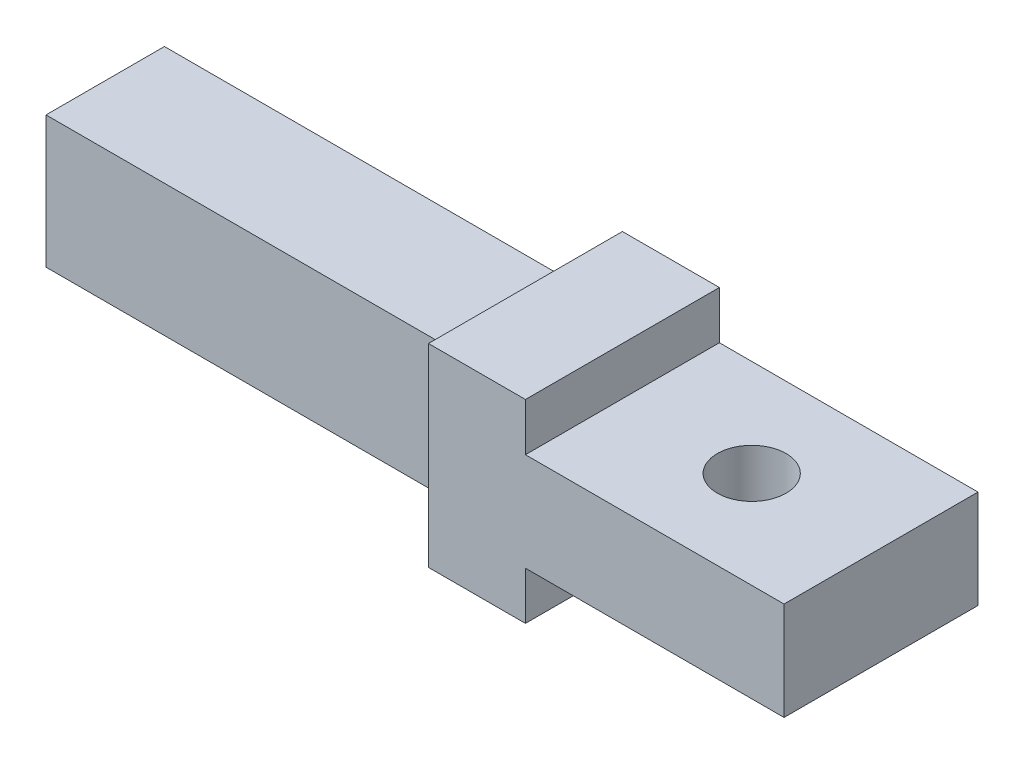
ISO-10303-21;
HEADER;
FILE_DESCRIPTION(('STEP AP214'),'2;1');
FILE_NAME('part.step','',(''),(''),'','','');
FILE_SCHEMA(('AUTOMOTIVE_DESIGN { 1 0 10303 214 1 1 1 1 }'));
ENDSEC;
DATA;
#1=APPLICATION_CONTEXT('core data for automotive mechanical design processes');
#2=APPLICATION_PROTOCOL_DEFINITION('international standard','automotive_design',2000,#1);
#3=PRODUCT_CONTEXT('',#1,'mechanical');
#4=PRODUCT('Part','Part','',(#3));
#5=PRODUCT_RELATED_PRODUCT_CATEGORY('part','',(#4));
#6=PRODUCT_DEFINITION_FORMATION('','',#4);
#7=PRODUCT_DEFINITION_CONTEXT('part definition',#1,'design');
#8=PRODUCT_DEFINITION('design','',#6,#7);
#9=PRODUCT_DEFINITION_SHAPE('','',#8);
#10=(LENGTH_UNIT() NAMED_UNIT(*) SI_UNIT(.MILLI.,.METRE.));
#11=(NAMED_UNIT(*) PLANE_ANGLE_UNIT() SI_UNIT($,.RADIAN.));
#12=(NAMED_UNIT(*) SI_UNIT($,.STERADIAN.) SOLID_ANGLE_UNIT());
#13=UNCERTAINTY_MEASURE_WITH_UNIT(LENGTH_MEASURE(1.E-05),#10,'distance_accuracy_value','');
#14=(GEOMETRIC_REPRESENTATION_CONTEXT(3) GLOBAL_UNCERTAINTY_ASSIGNED_CONTEXT((#13)) GLOBAL_UNIT_ASSIGNED_CONTEXT((#10,
#11,#12)) REPRESENTATION_CONTEXT('',''));
#15=CARTESIAN_POINT('',(0.,0.,0.));
#16=DIRECTION('',(0.,0.,1.));
#17=DIRECTION('',(1.,0.,0.));
#18=AXIS2_PLACEMENT_3D('',#15,#16,#17);
#19=CARTESIAN_POINT('',(76.2,0.,0.));
#20=DIRECTION('',(0.,0.,-1.));
#21=DIRECTION('',(-1.,0.,0.));
#22=AXIS2_PLACEMENT_3D('',#19,#20,#21);
#23=PLANE('',#22);
#24=DIRECTION('',(0.,1.,0.));
#25=VECTOR('',#24,1.);
#26=CARTESIAN_POINT('',(41.275,19.05,0.));
#27=LINE('',#26,#25);
#28=CARTESIAN_POINT('',(41.275,0.,0.));
#29=VERTEX_POINT('',#28);
#30=CARTESIAN_POINT('',(41.275,19.05,0.));
#31=VERTEX_POINT('',#30);
#32=EDGE_CURVE('E162',#29,#31,#27,.T.);
#33=ORIENTED_EDGE('',*,*,#32,.F.);
#34=DIRECTION('',(-1.,0.,0.));
#35=VECTOR('',#34,1.);
#36=CARTESIAN_POINT('',(76.2,0.,0.));
#37=LINE('',#36,#35);
#38=CARTESIAN_POINT('',(50.8,0.,0.));
#39=VERTEX_POINT('',#38);
#40=EDGE_CURVE('E11',#39,#29,#37,.T.);
#41=ORIENTED_EDGE('',*,*,#40,.F.);
#42=DIRECTION('',(0.,-1.,0.));
#43=VECTOR('',#42,1.);
#44=CARTESIAN_POINT('',(50.8,0.,0.));
#45=LINE('',#44,#43);
#46=CARTESIAN_POINT('',(50.8,4.699,0.));
#47=VERTEX_POINT('',#46);
#48=EDGE_CURVE('E195',#47,#39,#45,.T.);
#49=ORIENTED_EDGE('',*,*,#48,.F.);
#50=DIRECTION('',(-1.,0.,0.));
#51=VECTOR('',#50,1.);
#52=CARTESIAN_POINT('',(76.2,4.699,0.));
#53=LINE('',#52,#51);
#54=CARTESIAN_POINT('',(76.2,4.699,0.));
#55=VERTEX_POINT('',#54);
#56=EDGE_CURVE('E179',#55,#47,#53,.T.);
#57=ORIENTED_EDGE('',*,*,#56,.F.);
#58=DIRECTION('',(0.,-1.,0.));
#59=VECTOR('',#58,1.);
#60=CARTESIAN_POINT('',(76.2,0.,0.));
#61=LINE('',#60,#59);
#62=CARTESIAN_POINT('',(76.2,14.351,0.));
#63=VERTEX_POINT('',#62);
#64=EDGE_CURVE('E184',#63,#55,#61,.T.);
#65=ORIENTED_EDGE('',*,*,#64,.F.);
#66=DIRECTION('',(1.,0.,0.));
#67=VECTOR('',#66,1.);
#68=CARTESIAN_POINT('',(76.2,14.351,0.));
#69=LINE('',#68,#67);
#70=CARTESIAN_POINT('',(50.8,14.351,0.));
#71=VERTEX_POINT('',#70);
#72=EDGE_CURVE('E172',#71,#63,#69,.T.);
#73=ORIENTED_EDGE('',*,*,#72,.F.);
#74=DIRECTION('',(0.,-1.,0.));
#75=VECTOR('',#74,1.);
#76=CARTESIAN_POINT('',(50.8,19.05,0.));
#77=LINE('',#76,#75);
#78=CARTESIAN_POINT('',(50.8,19.05,0.));
#79=VERTEX_POINT('',#78);
#80=EDGE_CURVE('E176',#79,#71,#77,.T.);
#81=ORIENTED_EDGE('',*,*,#80,.F.);
#82=DIRECTION('',(-1.,0.,0.));
#83=VECTOR('',#82,1.);
#84=CARTESIAN_POINT('',(76.2,19.05,0.));
#85=LINE('',#84,#83);
#86=EDGE_CURVE('E207',#79,#31,#85,.T.);
#87=ORIENTED_EDGE('',*,*,#86,.T.);
#88=EDGE_LOOP('',(#33,#41,#49,#57,#65,#73,#81,#87));
#89=FACE_BOUND('',#88,.T.);
#90=ADVANCED_FACE('F41',(#89),#23,.F.);
#91=CARTESIAN_POINT('',(76.2,0.,0.));
#92=DIRECTION('',(0.,1.,0.));
#93=DIRECTION('',(0.,0.,1.));
#94=AXIS2_PLACEMENT_3D('',#91,#92,#93);
#95=PLANE('',#94);
#96=ORIENTED_EDGE('',*,*,#40,.T.);
#97=DIRECTION('',(0.,0.,1.));
#98=VECTOR('',#97,1.);
#99=CARTESIAN_POINT('',(41.275,0.,-19.05));
#100=LINE('',#99,#98);
#101=CARTESIAN_POINT('',(41.275,0.,-19.05));
#102=VERTEX_POINT('',#101);
#103=EDGE_CURVE('E160',#102,#29,#100,.T.);
#104=ORIENTED_EDGE('',*,*,#103,.F.);
#105=DIRECTION('',(-1.,0.,0.));
#106=VECTOR('',#105,1.);
#107=CARTESIAN_POINT('',(76.2,0.,-19.05));
#108=LINE('',#107,#106);
#109=CARTESIAN_POINT('',(50.8,0.,-19.05));
#110=VERTEX_POINT('',#109);
#111=EDGE_CURVE('E48',#110,#102,#108,.T.);
#112=ORIENTED_EDGE('',*,*,#111,.F.);
#113=DIRECTION('',(0.,0.,1.));
#114=VECTOR('',#113,1.);
#115=CARTESIAN_POINT('',(50.8,0.,-19.05));
#116=LINE('',#115,#114);
#117=EDGE_CURVE('E154',#110,#39,#116,.T.);
#118=ORIENTED_EDGE('',*,*,#117,.T.);
#119=EDGE_LOOP('',(#96,#104,#112,#118));
#120=FACE_BOUND('',#119,.T.);
#121=ADVANCED_FACE('F221',(#120),#95,.F.);
#122=CARTESIAN_POINT('',(76.2,0.,-19.05));
#123=DIRECTION('',(0.,0.,1.));
#124=DIRECTION('',(1.,0.,0.));
#125=AXIS2_PLACEMENT_3D('',#122,#123,#124);
#126=PLANE('',#125);
#127=ORIENTED_EDGE('',*,*,#111,.T.);
#128=DIRECTION('',(0.,1.,0.));
#129=VECTOR('',#128,1.);
#130=CARTESIAN_POINT('',(41.275,19.05,-19.05));
#131=LINE('',#130,#129);
#132=CARTESIAN_POINT('',(41.275,19.05,-19.05));
#133=VERTEX_POINT('',#132);
#134=EDGE_CURVE('E156',#102,#133,#131,.T.);
#135=ORIENTED_EDGE('',*,*,#134,.T.);
#136=DIRECTION('',(-1.,0.,0.));
#137=VECTOR('',#136,1.);
#138=CARTESIAN_POINT('',(76.2,19.05,-19.05));
#139=LINE('',#138,#137);
#140=CARTESIAN_POINT('',(50.8,19.05,-19.05));
#141=VERTEX_POINT('',#140);
#142=EDGE_CURVE('E210',#141,#133,#139,.T.);
#143=ORIENTED_EDGE('',*,*,#142,.F.);
#144=DIRECTION('',(0.,-1.,0.));
#145=VECTOR('',#144,1.);
#146=CARTESIAN_POINT('',(50.8,19.05,-19.05));
#147=LINE('',#146,#145);
#148=CARTESIAN_POINT('',(50.8,14.351,-19.05));
#149=VERTEX_POINT('',#148);
#150=EDGE_CURVE('E168',#141,#149,#147,.T.);
#151=ORIENTED_EDGE('',*,*,#150,.T.);
#152=DIRECTION('',(1.,0.,0.));
#153=VECTOR('',#152,1.);
#154=CARTESIAN_POINT('',(76.2,14.351,-19.05));
#155=LINE('',#154,#153);
#156=CARTESIAN_POINT('',(76.2,14.351,-19.05));
#157=VERTEX_POINT('',#156);
#158=EDGE_CURVE('E171',#149,#157,#155,.T.);
#159=ORIENTED_EDGE('',*,*,#158,.T.);
#160=DIRECTION('',(0.,1.,0.));
#161=VECTOR('',#160,1.);
#162=CARTESIAN_POINT('',(76.2,0.,-19.05));
#163=LINE('',#162,#161);
#164=CARTESIAN_POINT('',(76.2,4.699,-19.05));
#165=VERTEX_POINT('',#164);
#166=EDGE_CURVE('E204',#165,#157,#163,.T.);
#167=ORIENTED_EDGE('',*,*,#166,.F.);
#168=DIRECTION('',(-1.,0.,0.));
#169=VECTOR('',#168,1.);
#170=CARTESIAN_POINT('',(76.2,4.699,-19.05));
#171=LINE('',#170,#169);
#172=CARTESIAN_POINT('',(50.8,4.699,-19.05));
#173=VERTEX_POINT('',#172);
#174=EDGE_CURVE('E63',#165,#173,#171,.T.);
#175=ORIENTED_EDGE('',*,*,#174,.T.);
#176=DIRECTION('',(0.,-1.,0.));
#177=VECTOR('',#176,1.);
#178=CARTESIAN_POINT('',(50.8,0.,-19.05));
#179=LINE('',#178,#177);
#180=EDGE_CURVE('E190',#173,#110,#179,.T.);
#181=ORIENTED_EDGE('',*,*,#180,.T.);
#182=EDGE_LOOP('',(#127,#135,#143,#151,#159,#167,#175,#181));
#183=FACE_BOUND('',#182,.T.);
#184=ADVANCED_FACE('F216',(#183),#126,.F.);
#185=CARTESIAN_POINT('',(76.2,19.05,0.));
#186=DIRECTION('',(0.,-1.,0.));
#187=DIRECTION('',(0.,0.,-1.));
#188=AXIS2_PLACEMENT_3D('',#185,#186,#187);
#189=PLANE('',#188);
#190=ORIENTED_EDGE('',*,*,#142,.T.);
#191=DIRECTION('',(0.,0.,1.));
#192=VECTOR('',#191,1.);
#193=CARTESIAN_POINT('',(41.275,19.05,-19.05));
#194=LINE('',#193,#192);
#195=EDGE_CURVE('E150',#133,#31,#194,.T.);
#196=ORIENTED_EDGE('',*,*,#195,.T.);
#197=ORIENTED_EDGE('',*,*,#86,.F.);
#198=DIRECTION('',(0.,0.,1.));
#199=VECTOR('',#198,1.);
#200=CARTESIAN_POINT('',(50.8,19.05,-19.05));
#201=LINE('',#200,#199);
#202=EDGE_CURVE('E175',#141,#79,#201,.T.);
#203=ORIENTED_EDGE('',*,*,#202,.F.);
#204=EDGE_LOOP('',(#190,#196,#197,#203));
#205=FACE_BOUND('',#204,.T.);
#206=ADVANCED_FACE('F266',(#205),#189,.F.);
#207=CARTESIAN_POINT('',(76.2,0.,0.));
#208=DIRECTION('',(-1.,0.,0.));
#209=DIRECTION('',(0.,0.,1.));
#210=AXIS2_PLACEMENT_3D('',#207,#208,#209);
#211=PLANE('',#210);
#212=ORIENTED_EDGE('',*,*,#166,.T.);
#213=DIRECTION('',(0.,0.,1.));
#214=VECTOR('',#213,1.);
#215=CARTESIAN_POINT('',(76.2,14.351,-19.05));
#216=LINE('',#215,#214);
#217=EDGE_CURVE('E181',#157,#63,#216,.T.);
#218=ORIENTED_EDGE('',*,*,#217,.T.);
#219=ORIENTED_EDGE('',*,*,#64,.T.);
#220=DIRECTION('',(0.,0.,1.));
#221=VECTOR('',#220,1.);
#222=CARTESIAN_POINT('',(76.2,4.699,-19.05));
#223=LINE('',#222,#221);
#224=EDGE_CURVE('E188',#165,#55,#223,.T.);
#225=ORIENTED_EDGE('',*,*,#224,.F.);
#226=EDGE_LOOP('',(#212,#218,#219,#225));
#227=FACE_BOUND('',#226,.T.);
#228=ADVANCED_FACE('F260',(#227),#211,.F.);
#229=CARTESIAN_POINT('',(0.,0.,0.));
#230=DIRECTION('',(-1.,0.,0.));
#231=DIRECTION('',(0.,0.,1.));
#232=AXIS2_PLACEMENT_3D('',#229,#230,#231);
#233=PLANE('',#232);
#234=DIRECTION('',(0.,1.,0.));
#235=VECTOR('',#234,1.);
#236=CARTESIAN_POINT('',(0.,0.,-15.3416));
#237=LINE('',#236,#235);
#238=CARTESIAN_POINT('',(0.,3.048,-15.3416));
#239=VERTEX_POINT('',#238);
#240=CARTESIAN_POINT('',(0.,16.002,-15.3416));
#241=VERTEX_POINT('',#240);
#242=EDGE_CURVE('E55',#239,#241,#237,.T.);
#243=ORIENTED_EDGE('',*,*,#242,.F.);
#244=DIRECTION('',(0.,0.,1.));
#245=VECTOR('',#244,1.);
#246=CARTESIAN_POINT('',(0.,3.048,-19.05));
#247=LINE('',#246,#245);
#248=CARTESIAN_POINT('',(0.,3.048,-3.7084));
#249=VERTEX_POINT('',#248);
#250=EDGE_CURVE('E164',#239,#249,#247,.T.);
#251=ORIENTED_EDGE('',*,*,#250,.T.);
#252=DIRECTION('',(0.,1.,0.));
#253=VECTOR('',#252,1.);
#254=CARTESIAN_POINT('',(0.,0.,-3.7084));
#255=LINE('',#254,#253);
#256=CARTESIAN_POINT('',(0.,16.002,-3.7084));
#257=VERTEX_POINT('',#256);
#258=EDGE_CURVE('E235',#249,#257,#255,.T.);
#259=ORIENTED_EDGE('',*,*,#258,.T.);
#260=DIRECTION('',(0.,0.,1.));
#261=VECTOR('',#260,1.);
#262=CARTESIAN_POINT('',(0.,16.002,-19.05));
#263=LINE('',#262,#261);
#264=EDGE_CURVE('E151',#241,#257,#263,.T.);
#265=ORIENTED_EDGE('',*,*,#264,.F.);
#266=EDGE_LOOP('',(#243,#251,#259,#265));
#267=FACE_BOUND('',#266,.T.);
#268=ADVANCED_FACE('F274',(#267),#233,.T.);
#269=CARTESIAN_POINT('',(50.8,0.,-19.05));
#270=DIRECTION('',(-1.,0.,0.));
#271=DIRECTION('',(0.,0.,1.));
#272=AXIS2_PLACEMENT_3D('',#269,#270,#271);
#273=PLANE('',#272);
#274=ORIENTED_EDGE('',*,*,#48,.T.);
#275=ORIENTED_EDGE('',*,*,#117,.F.);
#276=ORIENTED_EDGE('',*,*,#180,.F.);
#277=DIRECTION('',(0.,0.,1.));
#278=VECTOR('',#277,1.);
#279=CARTESIAN_POINT('',(50.8,4.699,-19.05));
#280=LINE('',#279,#278);
#281=EDGE_CURVE('E191',#173,#47,#280,.T.);
#282=ORIENTED_EDGE('',*,*,#281,.T.);
#283=EDGE_LOOP('',(#274,#275,#276,#282));
#284=FACE_BOUND('',#283,.T.);
#285=ADVANCED_FACE('F296',(#284),#273,.F.);
#286=CARTESIAN_POINT('',(76.2,4.699,-19.05));
#287=DIRECTION('',(0.,1.,0.));
#288=DIRECTION('',(-1.,0.,0.));
#289=AXIS2_PLACEMENT_3D('',#286,#287,#288);
#290=PLANE('',#289);
#291=CARTESIAN_POINT('',(63.5,4.699,-9.525));
#292=DIRECTION('',(0.,1.,0.));
#293=DIRECTION('',(-1.,0.,0.));
#294=AXIS2_PLACEMENT_3D('',#291,#292,#293);
#295=CIRCLE('',#294,3.37819999999999);
#296=CARTESIAN_POINT('',(60.1218,4.699,-9.525));
#297=VERTEX_POINT('',#296);
#298=EDGE_CURVE('E238',#297,#297,#295,.T.);
#299=ORIENTED_EDGE('',*,*,#298,.T.);
#300=EDGE_LOOP('',(#299));
#301=FACE_BOUND('',#300,.T.);
#302=ORIENTED_EDGE('',*,*,#56,.T.);
#303=ORIENTED_EDGE('',*,*,#281,.F.);
#304=ORIENTED_EDGE('',*,*,#174,.F.);
#305=ORIENTED_EDGE('',*,*,#224,.T.);
#306=EDGE_LOOP('',(#302,#303,#304,#305));
#307=FACE_BOUND('',#306,.T.);
#308=ADVANCED_FACE('F254',(#301,#307),#290,.F.);
#309=CARTESIAN_POINT('',(76.2,14.351,-19.05));
#310=DIRECTION('',(0.,-1.,0.));
#311=DIRECTION('',(1.,0.,0.));
#312=AXIS2_PLACEMENT_3D('',#309,#310,#311);
#313=PLANE('',#312);
#314=CARTESIAN_POINT('',(63.5,14.351,-9.525));
#315=DIRECTION('',(0.,1.,0.));
#316=DIRECTION('',(0.,0.,1.));
#317=AXIS2_PLACEMENT_3D('',#314,#315,#316);
#318=CIRCLE('',#317,3.37819999999998);
#319=CARTESIAN_POINT('',(63.5,14.351,-6.14680000000002));
#320=VERTEX_POINT('',#319);
#321=EDGE_CURVE('E243',#320,#320,#318,.T.);
#322=ORIENTED_EDGE('',*,*,#321,.F.);
#323=EDGE_LOOP('',(#322));
#324=FACE_BOUND('',#323,.T.);
#325=ORIENTED_EDGE('',*,*,#72,.T.);
#326=ORIENTED_EDGE('',*,*,#217,.F.);
#327=ORIENTED_EDGE('',*,*,#158,.F.);
#328=DIRECTION('',(0.,0.,1.));
#329=VECTOR('',#328,1.);
#330=CARTESIAN_POINT('',(50.8,14.351,-19.05));
#331=LINE('',#330,#329);
#332=EDGE_CURVE('E185',#149,#71,#331,.T.);
#333=ORIENTED_EDGE('',*,*,#332,.T.);
#334=EDGE_LOOP('',(#325,#326,#327,#333));
#335=FACE_BOUND('',#334,.T.);
#336=ADVANCED_FACE('F250',(#324,#335),#313,.F.);
#337=CARTESIAN_POINT('',(50.8,19.05,-19.05));
#338=DIRECTION('',(-1.,0.,0.));
#339=DIRECTION('',(0.,0.,1.));
#340=AXIS2_PLACEMENT_3D('',#337,#338,#339);
#341=PLANE('',#340);
#342=ORIENTED_EDGE('',*,*,#80,.T.);
#343=ORIENTED_EDGE('',*,*,#332,.F.);
#344=ORIENTED_EDGE('',*,*,#150,.F.);
#345=ORIENTED_EDGE('',*,*,#202,.T.);
#346=EDGE_LOOP('',(#342,#343,#344,#345));
#347=FACE_BOUND('',#346,.T.);
#348=ADVANCED_FACE('F253',(#347),#341,.F.);
#349=CARTESIAN_POINT('',(0.,3.048,-19.05));
#350=DIRECTION('',(0.,1.,0.));
#351=DIRECTION('',(0.,0.,1.));
#352=AXIS2_PLACEMENT_3D('',#349,#350,#351);
#353=PLANE('',#352);
#354=ORIENTED_EDGE('',*,*,#250,.F.);
#355=DIRECTION('',(1.,0.,0.));
#356=VECTOR('',#355,1.);
#357=CARTESIAN_POINT('',(0.,3.048,-15.3416));
#358=LINE('',#357,#356);
#359=CARTESIAN_POINT('',(41.275,3.048,-15.3416));
#360=VERTEX_POINT('',#359);
#361=EDGE_CURVE('E167',#239,#360,#358,.T.);
#362=ORIENTED_EDGE('',*,*,#361,.T.);
#363=DIRECTION('',(0.,0.,1.));
#364=VECTOR('',#363,1.);
#365=CARTESIAN_POINT('',(41.275,3.048,-19.05));
#366=LINE('',#365,#364);
#367=CARTESIAN_POINT('',(41.275,3.048,-3.7084));
#368=VERTEX_POINT('',#367);
#369=EDGE_CURVE('E137',#360,#368,#366,.T.);
#370=ORIENTED_EDGE('',*,*,#369,.T.);
#371=DIRECTION('',(-1.,0.,0.));
#372=VECTOR('',#371,1.);
#373=CARTESIAN_POINT('',(0.,3.048,-3.7084));
#374=LINE('',#373,#372);
#375=EDGE_CURVE('E139',#368,#249,#374,.T.);
#376=ORIENTED_EDGE('',*,*,#375,.T.);
#377=EDGE_LOOP('',(#354,#362,#370,#376));
#378=FACE_BOUND('',#377,.T.);
#379=ADVANCED_FACE('F303',(#378),#353,.F.);
#380=CARTESIAN_POINT('',(41.275,19.05,-19.05));
#381=DIRECTION('',(1.,0.,0.));
#382=DIRECTION('',(0.,1.,0.));
#383=AXIS2_PLACEMENT_3D('',#380,#381,#382);
#384=PLANE('',#383);
#385=ORIENTED_EDGE('',*,*,#369,.F.);
#386=DIRECTION('',(0.,1.,0.));
#387=VECTOR('',#386,1.);
#388=CARTESIAN_POINT('',(41.275,0.,-15.3416));
#389=LINE('',#388,#387);
#390=CARTESIAN_POINT('',(41.275,16.002,-15.3416));
#391=VERTEX_POINT('',#390);
#392=EDGE_CURVE('E130',#360,#391,#389,.T.);
#393=ORIENTED_EDGE('',*,*,#392,.T.);
#394=DIRECTION('',(0.,0.,1.));
#395=VECTOR('',#394,1.);
#396=CARTESIAN_POINT('',(41.275,16.002,-19.05));
#397=LINE('',#396,#395);
#398=CARTESIAN_POINT('',(41.275,16.002,-3.7084));
#399=VERTEX_POINT('',#398);
#400=EDGE_CURVE('E135',#391,#399,#397,.T.);
#401=ORIENTED_EDGE('',*,*,#400,.T.);
#402=DIRECTION('',(0.,1.,0.));
#403=VECTOR('',#402,1.);
#404=CARTESIAN_POINT('',(41.275,0.,-3.7084));
#405=LINE('',#404,#403);
#406=EDGE_CURVE('E234',#368,#399,#405,.T.);
#407=ORIENTED_EDGE('',*,*,#406,.F.);
#408=EDGE_LOOP('',(#385,#393,#401,#407));
#409=FACE_BOUND('',#408,.T.);
#410=ORIENTED_EDGE('',*,*,#32,.T.);
#411=ORIENTED_EDGE('',*,*,#195,.F.);
#412=ORIENTED_EDGE('',*,*,#134,.F.);
#413=ORIENTED_EDGE('',*,*,#103,.T.);
#414=EDGE_LOOP('',(#410,#411,#412,#413));
#415=FACE_BOUND('',#414,.T.);
#416=ADVANCED_FACE('F131',(#409,#415),#384,.F.);
#417=CARTESIAN_POINT('',(0.,16.002,-19.05));
#418=DIRECTION('',(0.,-1.,0.));
#419=DIRECTION('',(1.,0.,0.));
#420=AXIS2_PLACEMENT_3D('',#417,#418,#419);
#421=PLANE('',#420);
#422=ORIENTED_EDGE('',*,*,#400,.F.);
#423=DIRECTION('',(1.,0.,0.));
#424=VECTOR('',#423,1.);
#425=CARTESIAN_POINT('',(0.,16.002,-15.3416));
#426=LINE('',#425,#424);
#427=EDGE_CURVE('E141',#241,#391,#426,.T.);
#428=ORIENTED_EDGE('',*,*,#427,.F.);
#429=ORIENTED_EDGE('',*,*,#264,.T.);
#430=DIRECTION('',(-1.,0.,0.));
#431=VECTOR('',#430,1.);
#432=CARTESIAN_POINT('',(0.,16.002,-3.7084));
#433=LINE('',#432,#431);
#434=EDGE_CURVE('E146',#399,#257,#433,.T.);
#435=ORIENTED_EDGE('',*,*,#434,.F.);
#436=EDGE_LOOP('',(#422,#428,#429,#435));
#437=FACE_BOUND('',#436,.T.);
#438=ADVANCED_FACE('F149',(#437),#421,.F.);
#439=CARTESIAN_POINT('',(0.,0.,-3.7084));
#440=DIRECTION('',(0.,0.,-1.));
#441=DIRECTION('',(-1.,0.,0.));
#442=AXIS2_PLACEMENT_3D('',#439,#440,#441);
#443=PLANE('',#442);
#444=ORIENTED_EDGE('',*,*,#406,.T.);
#445=ORIENTED_EDGE('',*,*,#434,.T.);
#446=ORIENTED_EDGE('',*,*,#258,.F.);
#447=ORIENTED_EDGE('',*,*,#375,.F.);
#448=EDGE_LOOP('',(#444,#445,#446,#447));
#449=FACE_BOUND('',#448,.T.);
#450=ADVANCED_FACE('F325',(#449),#443,.F.);
#451=CARTESIAN_POINT('',(0.,0.,-15.3416));
#452=DIRECTION('',(0.,0.,1.));
#453=DIRECTION('',(1.,0.,0.));
#454=AXIS2_PLACEMENT_3D('',#451,#452,#453);
#455=PLANE('',#454);
#456=ORIENTED_EDGE('',*,*,#242,.T.);
#457=ORIENTED_EDGE('',*,*,#427,.T.);
#458=ORIENTED_EDGE('',*,*,#392,.F.);
#459=ORIENTED_EDGE('',*,*,#361,.F.);
#460=EDGE_LOOP('',(#456,#457,#458,#459));
#461=FACE_BOUND('',#460,.T.);
#462=ADVANCED_FACE('F142',(#461),#455,.F.);
#463=CARTESIAN_POINT('',(63.5,14.351,-9.525));
#464=DIRECTION('',(0.,1.,0.));
#465=DIRECTION('',(0.,0.,1.));
#466=AXIS2_PLACEMENT_3D('',#463,#464,#465);
#467=CYLINDRICAL_SURFACE('',#466,3.37819999999999);
#468=ORIENTED_EDGE('',*,*,#321,.T.);
#469=EDGE_LOOP('',(#468));
#470=FACE_BOUND('',#469,.T.);
#471=ORIENTED_EDGE('',*,*,#298,.F.);
#472=EDGE_LOOP('',(#471));
#473=FACE_BOUND('',#472,.T.);
#474=ADVANCED_FACE('F247',(#470,#473),#467,.F.);
#475=CLOSED_SHELL('',(#90,#121,#184,#206,#228,#268,#285,#308,#336,#348,#379,#416,#438,#450,#462,#474));
#476=MANIFOLD_SOLID_BREP('B2',#475);
#477=ADVANCED_BREP_SHAPE_REPRESENTATION('',(#18,#476),#14);
#478=SHAPE_DEFINITION_REPRESENTATION(#9,#477);
ENDSEC;
END-ISO-10303-21;
